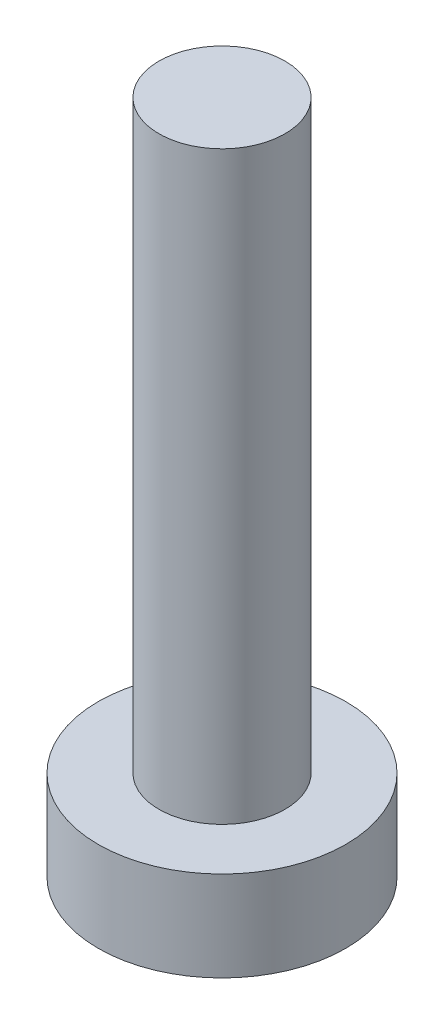
ISO-10303-21;
HEADER;
FILE_DESCRIPTION(('STEP AP214'),'2;1');
FILE_NAME('part.step','',(''),(''),'','','');
FILE_SCHEMA(('AUTOMOTIVE_DESIGN { 1 0 10303 214 1 1 1 1 }'));
ENDSEC;
DATA;
#1=APPLICATION_CONTEXT('core data for automotive mechanical design processes');
#2=APPLICATION_PROTOCOL_DEFINITION('international standard','automotive_design',2000,#1);
#3=PRODUCT_CONTEXT('',#1,'mechanical');
#4=PRODUCT('Part','Part','',(#3));
#5=PRODUCT_RELATED_PRODUCT_CATEGORY('part','',(#4));
#6=PRODUCT_DEFINITION_FORMATION('','',#4);
#7=PRODUCT_DEFINITION_CONTEXT('part definition',#1,'design');
#8=PRODUCT_DEFINITION('design','',#6,#7);
#9=PRODUCT_DEFINITION_SHAPE('','',#8);
#10=(LENGTH_UNIT() NAMED_UNIT(*) SI_UNIT(.MILLI.,.METRE.));
#11=(NAMED_UNIT(*) PLANE_ANGLE_UNIT() SI_UNIT($,.RADIAN.));
#12=(NAMED_UNIT(*) SI_UNIT($,.STERADIAN.) SOLID_ANGLE_UNIT());
#13=UNCERTAINTY_MEASURE_WITH_UNIT(LENGTH_MEASURE(1.E-05),#10,'distance_accuracy_value','');
#14=(GEOMETRIC_REPRESENTATION_CONTEXT(3) GLOBAL_UNCERTAINTY_ASSIGNED_CONTEXT((#13)) GLOBAL_UNIT_ASSIGNED_CONTEXT((#10,
#11,#12)) REPRESENTATION_CONTEXT('',''));
#15=CARTESIAN_POINT('',(0.,0.,0.));
#16=DIRECTION('',(0.,0.,1.));
#17=DIRECTION('',(1.,0.,0.));
#18=AXIS2_PLACEMENT_3D('',#15,#16,#17);
#19=CARTESIAN_POINT('',(0.,2.,0.));
#20=DIRECTION('',(0.,-1.,0.));
#21=DIRECTION('',(0.,0.,-1.));
#22=AXIS2_PLACEMENT_3D('',#19,#20,#21);
#23=CYLINDRICAL_SURFACE('',#22,2.75);
#24=CARTESIAN_POINT('',(0.,2.,0.));
#25=DIRECTION('',(0.,1.,0.));
#26=DIRECTION('',(0.,0.,1.));
#27=AXIS2_PLACEMENT_3D('',#24,#25,#26);
#28=CIRCLE('',#27,2.75);
#29=CARTESIAN_POINT('',(0.,2.,2.75));
#30=VERTEX_POINT('',#29);
#31=EDGE_CURVE('E48',#30,#30,#28,.T.);
#32=ORIENTED_EDGE('',*,*,#31,.F.);
#33=EDGE_LOOP('',(#32));
#34=FACE_BOUND('',#33,.T.);
#35=CARTESIAN_POINT('',(0.,0.,0.));
#36=DIRECTION('',(0.,1.,0.));
#37=DIRECTION('',(0.,0.,1.));
#38=AXIS2_PLACEMENT_3D('',#35,#36,#37);
#39=CIRCLE('',#38,2.75);
#40=CARTESIAN_POINT('',(0.,0.,2.75));
#41=VERTEX_POINT('',#40);
#42=EDGE_CURVE('E42',#41,#41,#39,.T.);
#43=ORIENTED_EDGE('',*,*,#42,.T.);
#44=EDGE_LOOP('',(#43));
#45=FACE_BOUND('',#44,.T.);
#46=ADVANCED_FACE('F39',(#34,#45),#23,.T.);
#47=CARTESIAN_POINT('',(0.,2.,0.));
#48=DIRECTION('',(0.,1.,0.));
#49=DIRECTION('',(0.,0.,1.));
#50=AXIS2_PLACEMENT_3D('',#47,#48,#49);
#51=PLANE('',#50);
#52=CARTESIAN_POINT('',(0.,2.,0.));
#53=DIRECTION('',(0.,1.,0.));
#54=DIRECTION('',(0.,0.,1.));
#55=AXIS2_PLACEMENT_3D('',#52,#53,#54);
#56=CIRCLE('',#55,1.4);
#57=CARTESIAN_POINT('',(0.,2.,-1.4));
#58=VERTEX_POINT('',#57);
#59=EDGE_CURVE('E11',#58,#58,#56,.T.);
#60=ORIENTED_EDGE('',*,*,#59,.F.);
#61=EDGE_LOOP('',(#60));
#62=FACE_BOUND('',#61,.T.);
#63=ORIENTED_EDGE('',*,*,#31,.T.);
#64=EDGE_LOOP('',(#63));
#65=FACE_BOUND('',#64,.T.);
#66=ADVANCED_FACE('F179',(#62,#65),#51,.T.);
#67=CARTESIAN_POINT('',(0.,0.,0.));
#68=DIRECTION('',(0.,1.,0.));
#69=DIRECTION('',(0.,0.,1.));
#70=AXIS2_PLACEMENT_3D('',#67,#68,#69);
#71=PLANE('',#70);
#72=DIRECTION('',(-0.5,0.,0.866025403784438));
#73=VECTOR('',#72,1.);
#74=CARTESIAN_POINT('',(1.15470053837925,0.,0.));
#75=LINE('',#74,#73);
#76=CARTESIAN_POINT('',(1.15470053837925,0.,0.));
#77=VERTEX_POINT('',#76);
#78=CARTESIAN_POINT('',(0.577350269189625,0.,1.));
#79=VERTEX_POINT('',#78);
#80=EDGE_CURVE('E136',#77,#79,#75,.T.);
#81=ORIENTED_EDGE('',*,*,#80,.F.);
#82=DIRECTION('',(0.5,0.,0.866025403784439));
#83=VECTOR('',#82,1.);
#84=CARTESIAN_POINT('',(0.577350269189626,0.,-1.));
#85=LINE('',#84,#83);
#86=CARTESIAN_POINT('',(0.577350269189626,0.,-1.));
#87=VERTEX_POINT('',#86);
#88=EDGE_CURVE('E56',#87,#77,#85,.T.);
#89=ORIENTED_EDGE('',*,*,#88,.F.);
#90=DIRECTION('',(1.,0.,0.));
#91=VECTOR('',#90,1.);
#92=CARTESIAN_POINT('',(-0.577350269189626,0.,-1.));
#93=LINE('',#92,#91);
#94=CARTESIAN_POINT('',(-0.577350269189626,0.,-1.));
#95=VERTEX_POINT('',#94);
#96=EDGE_CURVE('E149',#95,#87,#93,.T.);
#97=ORIENTED_EDGE('',*,*,#96,.F.);
#98=DIRECTION('',(0.5,0.,-0.866025403784438));
#99=VECTOR('',#98,1.);
#100=CARTESIAN_POINT('',(-1.15470053837925,0.,0.));
#101=LINE('',#100,#99);
#102=CARTESIAN_POINT('',(-1.15470053837925,0.,0.));
#103=VERTEX_POINT('',#102);
#104=EDGE_CURVE('E146',#103,#95,#101,.T.);
#105=ORIENTED_EDGE('',*,*,#104,.F.);
#106=DIRECTION('',(-0.5,0.,-0.866025403784439));
#107=VECTOR('',#106,1.);
#108=CARTESIAN_POINT('',(-0.577350269189626,0.,1.));
#109=LINE('',#108,#107);
#110=CARTESIAN_POINT('',(-0.577350269189626,0.,1.));
#111=VERTEX_POINT('',#110);
#112=EDGE_CURVE('E104',#111,#103,#109,.T.);
#113=ORIENTED_EDGE('',*,*,#112,.F.);
#114=DIRECTION('',(-1.,0.,0.));
#115=VECTOR('',#114,1.);
#116=CARTESIAN_POINT('',(0.577350269189625,0.,1.));
#117=LINE('',#116,#115);
#118=EDGE_CURVE('E140',#79,#111,#117,.T.);
#119=ORIENTED_EDGE('',*,*,#118,.F.);
#120=EDGE_LOOP('',(#81,#89,#97,#105,#113,#119));
#121=FACE_BOUND('',#120,.T.);
#122=ORIENTED_EDGE('',*,*,#42,.F.);
#123=EDGE_LOOP('',(#122));
#124=FACE_BOUND('',#123,.T.);
#125=ADVANCED_FACE('F176',(#121,#124),#71,.F.);
#126=CARTESIAN_POINT('',(0.,15.,0.));
#127=DIRECTION('',(0.,-1.,0.));
#128=DIRECTION('',(0.,0.,-1.));
#129=AXIS2_PLACEMENT_3D('',#126,#127,#128);
#130=CYLINDRICAL_SURFACE('',#129,1.4);
#131=CARTESIAN_POINT('',(0.,15.,0.));
#132=DIRECTION('',(0.,1.,0.));
#133=DIRECTION('',(0.,0.,1.));
#134=AXIS2_PLACEMENT_3D('',#131,#132,#133);
#135=CIRCLE('',#134,1.4);
#136=CARTESIAN_POINT('',(0.,15.,-1.4));
#137=VERTEX_POINT('',#136);
#138=EDGE_CURVE('E155',#137,#137,#135,.T.);
#139=CARTESIAN_POINT('',(0.,15.,-1.4));
#140=CARTESIAN_POINT('',(0.,14.8645833333333,-1.4));
#141=CARTESIAN_POINT('',(0.,14.7291666666667,-1.4));
#142=CARTESIAN_POINT('',(0.,14.4583333333333,-1.4));
#143=CARTESIAN_POINT('',(0.,14.3229166666667,-1.4));
#144=CARTESIAN_POINT('',(0.,14.0520833333333,-1.4));
#145=CARTESIAN_POINT('',(0.,13.9166666666667,-1.4));
#146=CARTESIAN_POINT('',(0.,13.6458333333333,-1.4));
#147=CARTESIAN_POINT('',(0.,13.5104166666667,-1.4));
#148=CARTESIAN_POINT('',(0.,13.2395833333333,-1.4));
#149=CARTESIAN_POINT('',(0.,13.1041666666667,-1.4));
#150=CARTESIAN_POINT('',(0.,12.8333333333333,-1.4));
#151=CARTESIAN_POINT('',(0.,12.6979166666667,-1.4));
#152=CARTESIAN_POINT('',(0.,12.4270833333333,-1.4));
#153=CARTESIAN_POINT('',(0.,12.2916666666667,-1.4));
#154=CARTESIAN_POINT('',(0.,12.0208333333333,-1.4));
#155=CARTESIAN_POINT('',(0.,11.8854166666667,-1.4));
#156=CARTESIAN_POINT('',(0.,11.6145833333333,-1.4));
#157=CARTESIAN_POINT('',(0.,11.4791666666667,-1.4));
#158=CARTESIAN_POINT('',(0.,11.2083333333333,-1.4));
#159=CARTESIAN_POINT('',(0.,11.0729166666667,-1.4));
#160=CARTESIAN_POINT('',(0.,10.8020833333333,-1.4));
#161=CARTESIAN_POINT('',(0.,10.6666666666667,-1.4));
#162=CARTESIAN_POINT('',(0.,10.3958333333333,-1.4));
#163=CARTESIAN_POINT('',(0.,10.2604166666667,-1.4));
#164=CARTESIAN_POINT('',(0.,9.98958333333333,-1.4));
#165=CARTESIAN_POINT('',(0.,9.85416666666667,-1.4));
#166=CARTESIAN_POINT('',(0.,9.58333333333333,-1.4));
#167=CARTESIAN_POINT('',(0.,9.44791666666667,-1.4));
#168=CARTESIAN_POINT('',(0.,9.17708333333333,-1.4));
#169=CARTESIAN_POINT('',(0.,9.04166666666667,-1.4));
#170=CARTESIAN_POINT('',(0.,8.77083333333333,-1.4));
#171=CARTESIAN_POINT('',(0.,8.63541666666667,-1.4));
#172=CARTESIAN_POINT('',(0.,8.36458333333333,-1.4));
#173=CARTESIAN_POINT('',(0.,8.22916666666667,-1.4));
#174=CARTESIAN_POINT('',(0.,7.95833333333333,-1.4));
#175=CARTESIAN_POINT('',(0.,7.82291666666667,-1.4));
#176=CARTESIAN_POINT('',(0.,7.55208333333333,-1.4));
#177=CARTESIAN_POINT('',(0.,7.41666666666667,-1.4));
#178=CARTESIAN_POINT('',(0.,7.14583333333333,-1.4));
#179=CARTESIAN_POINT('',(0.,7.01041666666667,-1.4));
#180=CARTESIAN_POINT('',(0.,6.73958333333333,-1.4));
#181=CARTESIAN_POINT('',(0.,6.60416666666667,-1.4));
#182=CARTESIAN_POINT('',(0.,6.33333333333333,-1.4));
#183=CARTESIAN_POINT('',(0.,6.19791666666667,-1.4));
#184=CARTESIAN_POINT('',(0.,5.92708333333333,-1.4));
#185=CARTESIAN_POINT('',(0.,5.79166666666667,-1.4));
#186=CARTESIAN_POINT('',(0.,5.52083333333333,-1.4));
#187=CARTESIAN_POINT('',(0.,5.38541666666667,-1.4));
#188=CARTESIAN_POINT('',(0.,5.11458333333333,-1.4));
#189=CARTESIAN_POINT('',(0.,4.97916666666667,-1.4));
#190=CARTESIAN_POINT('',(0.,4.70833333333333,-1.4));
#191=CARTESIAN_POINT('',(0.,4.57291666666667,-1.4));
#192=CARTESIAN_POINT('',(0.,4.30208333333333,-1.4));
#193=CARTESIAN_POINT('',(0.,4.16666666666667,-1.4));
#194=CARTESIAN_POINT('',(0.,3.89583333333333,-1.4));
#195=CARTESIAN_POINT('',(0.,3.76041666666667,-1.4));
#196=CARTESIAN_POINT('',(0.,3.48958333333333,-1.4));
#197=CARTESIAN_POINT('',(0.,3.35416666666667,-1.4));
#198=CARTESIAN_POINT('',(0.,3.08333333333333,-1.4));
#199=CARTESIAN_POINT('',(0.,2.94791666666667,-1.4));
#200=CARTESIAN_POINT('',(0.,2.67708333333333,-1.4));
#201=CARTESIAN_POINT('',(0.,2.54166666666667,-1.4));
#202=CARTESIAN_POINT('',(0.,2.27083333333333,-1.4));
#203=CARTESIAN_POINT('',(0.,2.13541666666667,-1.4));
#204=CARTESIAN_POINT('',(0.,2.,-1.4));
#205=B_SPLINE_CURVE_WITH_KNOTS('',3,(#139,#140,#141,#142,#143,#144,#145,#146,#147,#148,#149,
#150,#151,#152,#153,#154,#155,#156,#157,#158,#159,#160,#161,#162,#163,#164,#165,#166,#167,#168,
#169,#170,#171,#172,#173,#174,#175,#176,#177,#178,#179,#180,#181,#182,#183,#184,#185,#186,#187,
#188,#189,#190,#191,#192,#193,#194,#195,#196,#197,#198,#199,#200,#201,#202,#203,#204),
.UNSPECIFIED.,.F.,.F.,(4,2,2,2,2,2,2,2,2,2,2,2,2,2,2,2,2,2,2,2,2,2,2,2,2,2,2,2,2,2,2,2,4),(0.,
0.406249999999999,0.812499999999999,1.21875,1.625,2.03125,2.4375,2.84375,3.25,3.65625,4.0625,
4.46875,4.875,5.28125,5.6875,6.09375,6.5,6.90625,7.3125,7.71875,8.125,8.53125,8.9375,9.34375,
9.75,10.15625,10.5625,10.96875,11.375,11.78125,12.1875,12.59375,13.),.UNSPECIFIED.);
#206=EDGE_CURVE('BSEAM178',#137,#58,#205,.T.);
#207=ORIENTED_EDGE('',*,*,#138,.F.);
#208=ORIENTED_EDGE('',*,*,#59,.T.);
#209=ORIENTED_EDGE('',*,*,#206,.T.);
#210=ORIENTED_EDGE('',*,*,#206,.F.);
#211=EDGE_LOOP('',(#207,#209,#208,#210));
#212=FACE_BOUND('',#211,.T.);
#213=ADVANCED_FACE('F178',(#212),#130,.T.);
#214=CARTESIAN_POINT('',(0.,15.,0.));
#215=DIRECTION('',(0.,1.,0.));
#216=DIRECTION('',(0.,0.,1.));
#217=AXIS2_PLACEMENT_3D('',#214,#215,#216);
#218=PLANE('',#217);
#219=ORIENTED_EDGE('',*,*,#138,.T.);
#220=EDGE_LOOP('',(#219));
#221=FACE_BOUND('',#220,.T.);
#222=ADVANCED_FACE('F185',(#221),#218,.T.);
#223=CARTESIAN_POINT('',(0.577350269189626,1.5,-1.));
#224=DIRECTION('',(0.866025403784439,0.,-0.5));
#225=DIRECTION('',(-0.5,0.,-0.866025403784439));
#226=AXIS2_PLACEMENT_3D('',#223,#224,#225);
#227=PLANE('',#226);
#228=ORIENTED_EDGE('',*,*,#88,.T.);
#229=DIRECTION('',(0.,-1.,0.));
#230=VECTOR('',#229,1.);
#231=CARTESIAN_POINT('',(1.15470053837925,1.5,0.));
#232=LINE('',#231,#230);
#233=CARTESIAN_POINT('',(1.15470053837925,1.5,0.));
#234=VERTEX_POINT('',#233);
#235=EDGE_CURVE('E86',#234,#77,#232,.T.);
#236=ORIENTED_EDGE('',*,*,#235,.F.);
#237=DIRECTION('',(0.5,0.,0.866025403784439));
#238=VECTOR('',#237,1.);
#239=CARTESIAN_POINT('',(0.577350269189626,1.5,-1.));
#240=LINE('',#239,#238);
#241=CARTESIAN_POINT('',(0.577350269189626,1.5,-1.));
#242=VERTEX_POINT('',#241);
#243=EDGE_CURVE('E152',#242,#234,#240,.T.);
#244=ORIENTED_EDGE('',*,*,#243,.F.);
#245=DIRECTION('',(0.,-1.,0.));
#246=VECTOR('',#245,1.);
#247=CARTESIAN_POINT('',(0.577350269189626,1.5,-1.));
#248=LINE('',#247,#246);
#249=EDGE_CURVE('E64',#242,#87,#248,.T.);
#250=ORIENTED_EDGE('',*,*,#249,.T.);
#251=EDGE_LOOP('',(#228,#236,#244,#250));
#252=FACE_BOUND('',#251,.T.);
#253=ADVANCED_FACE('F214',(#252),#227,.F.);
#254=CARTESIAN_POINT('',(-0.577350269189626,1.5,-1.));
#255=DIRECTION('',(0.,0.,-1.));
#256=DIRECTION('',(-1.,0.,0.));
#257=AXIS2_PLACEMENT_3D('',#254,#255,#256);
#258=PLANE('',#257);
#259=ORIENTED_EDGE('',*,*,#96,.T.);
#260=ORIENTED_EDGE('',*,*,#249,.F.);
#261=DIRECTION('',(1.,0.,0.));
#262=VECTOR('',#261,1.);
#263=CARTESIAN_POINT('',(-0.577350269189626,1.5,-1.));
#264=LINE('',#263,#262);
#265=CARTESIAN_POINT('',(-0.577350269189626,1.5,-1.));
#266=VERTEX_POINT('',#265);
#267=EDGE_CURVE('E118',#266,#242,#264,.T.);
#268=ORIENTED_EDGE('',*,*,#267,.F.);
#269=DIRECTION('',(0.,-1.,0.));
#270=VECTOR('',#269,1.);
#271=CARTESIAN_POINT('',(-0.577350269189626,1.5,-1.));
#272=LINE('',#271,#270);
#273=EDGE_CURVE('E109',#266,#95,#272,.T.);
#274=ORIENTED_EDGE('',*,*,#273,.T.);
#275=EDGE_LOOP('',(#259,#260,#268,#274));
#276=FACE_BOUND('',#275,.T.);
#277=ADVANCED_FACE('F228',(#276),#258,.F.);
#278=CARTESIAN_POINT('',(-1.15470053837925,1.5,0.));
#279=DIRECTION('',(-0.866025403784439,0.,-0.5));
#280=DIRECTION('',(-0.5,0.,0.866025403784439));
#281=AXIS2_PLACEMENT_3D('',#278,#279,#280);
#282=PLANE('',#281);
#283=ORIENTED_EDGE('',*,*,#104,.T.);
#284=ORIENTED_EDGE('',*,*,#273,.F.);
#285=DIRECTION('',(0.5,0.,-0.866025403784438));
#286=VECTOR('',#285,1.);
#287=CARTESIAN_POINT('',(-1.15470053837925,1.5,0.));
#288=LINE('',#287,#286);
#289=CARTESIAN_POINT('',(-1.15470053837925,1.5,0.));
#290=VERTEX_POINT('',#289);
#291=EDGE_CURVE('E113',#290,#266,#288,.T.);
#292=ORIENTED_EDGE('',*,*,#291,.F.);
#293=DIRECTION('',(0.,-1.,0.));
#294=VECTOR('',#293,1.);
#295=CARTESIAN_POINT('',(-1.15470053837925,1.5,0.));
#296=LINE('',#295,#294);
#297=EDGE_CURVE('E97',#290,#103,#296,.T.);
#298=ORIENTED_EDGE('',*,*,#297,.T.);
#299=EDGE_LOOP('',(#283,#284,#292,#298));
#300=FACE_BOUND('',#299,.T.);
#301=ADVANCED_FACE('F114',(#300),#282,.F.);
#302=CARTESIAN_POINT('',(-0.577350269189626,1.5,1.));
#303=DIRECTION('',(-0.866025403784438,0.,0.5));
#304=DIRECTION('',(0.5,0.,0.866025403784439));
#305=AXIS2_PLACEMENT_3D('',#302,#303,#304);
#306=PLANE('',#305);
#307=ORIENTED_EDGE('',*,*,#112,.T.);
#308=ORIENTED_EDGE('',*,*,#297,.F.);
#309=DIRECTION('',(-0.5,0.,-0.866025403784439));
#310=VECTOR('',#309,1.);
#311=CARTESIAN_POINT('',(-0.577350269189626,1.5,1.));
#312=LINE('',#311,#310);
#313=CARTESIAN_POINT('',(-0.577350269189626,1.5,1.));
#314=VERTEX_POINT('',#313);
#315=EDGE_CURVE('E101',#314,#290,#312,.T.);
#316=ORIENTED_EDGE('',*,*,#315,.F.);
#317=DIRECTION('',(0.,-1.,0.));
#318=VECTOR('',#317,1.);
#319=CARTESIAN_POINT('',(-0.577350269189626,1.5,1.));
#320=LINE('',#319,#318);
#321=EDGE_CURVE('E110',#314,#111,#320,.T.);
#322=ORIENTED_EDGE('',*,*,#321,.T.);
#323=EDGE_LOOP('',(#307,#308,#316,#322));
#324=FACE_BOUND('',#323,.T.);
#325=ADVANCED_FACE('F99',(#324),#306,.F.);
#326=CARTESIAN_POINT('',(0.577350269189625,1.5,1.));
#327=DIRECTION('',(0.,0.,1.));
#328=DIRECTION('',(1.,0.,0.));
#329=AXIS2_PLACEMENT_3D('',#326,#327,#328);
#330=PLANE('',#329);
#331=ORIENTED_EDGE('',*,*,#118,.T.);
#332=ORIENTED_EDGE('',*,*,#321,.F.);
#333=DIRECTION('',(-1.,0.,0.));
#334=VECTOR('',#333,1.);
#335=CARTESIAN_POINT('',(0.577350269189625,1.5,1.));
#336=LINE('',#335,#334);
#337=CARTESIAN_POINT('',(0.577350269189625,1.5,1.));
#338=VERTEX_POINT('',#337);
#339=EDGE_CURVE('E124',#338,#314,#336,.T.);
#340=ORIENTED_EDGE('',*,*,#339,.F.);
#341=DIRECTION('',(0.,-1.,0.));
#342=VECTOR('',#341,1.);
#343=CARTESIAN_POINT('',(0.577350269189625,1.5,1.));
#344=LINE('',#343,#342);
#345=EDGE_CURVE('E160',#338,#79,#344,.T.);
#346=ORIENTED_EDGE('',*,*,#345,.T.);
#347=EDGE_LOOP('',(#331,#332,#340,#346));
#348=FACE_BOUND('',#347,.T.);
#349=ADVANCED_FACE('F253',(#348),#330,.F.);
#350=CARTESIAN_POINT('',(1.15470053837925,1.5,0.));
#351=DIRECTION('',(0.866025403784438,0.,0.5));
#352=DIRECTION('',(0.5,0.,-0.866025403784438));
#353=AXIS2_PLACEMENT_3D('',#350,#351,#352);
#354=PLANE('',#353);
#355=ORIENTED_EDGE('',*,*,#80,.T.);
#356=ORIENTED_EDGE('',*,*,#345,.F.);
#357=DIRECTION('',(-0.5,0.,0.866025403784438));
#358=VECTOR('',#357,1.);
#359=CARTESIAN_POINT('',(1.15470053837925,1.5,0.));
#360=LINE('',#359,#358);
#361=EDGE_CURVE('E128',#234,#338,#360,.T.);
#362=ORIENTED_EDGE('',*,*,#361,.F.);
#363=ORIENTED_EDGE('',*,*,#235,.T.);
#364=EDGE_LOOP('',(#355,#356,#362,#363));
#365=FACE_BOUND('',#364,.T.);
#366=ADVANCED_FACE('F262',(#365),#354,.F.);
#367=CARTESIAN_POINT('',(0.,1.5,0.));
#368=DIRECTION('',(0.,-1.,0.));
#369=DIRECTION('',(0.,0.,-1.));
#370=AXIS2_PLACEMENT_3D('',#367,#368,#369);
#371=PLANE('',#370);
#372=ORIENTED_EDGE('',*,*,#243,.T.);
#373=ORIENTED_EDGE('',*,*,#361,.T.);
#374=ORIENTED_EDGE('',*,*,#339,.T.);
#375=ORIENTED_EDGE('',*,*,#315,.T.);
#376=ORIENTED_EDGE('',*,*,#291,.T.);
#377=ORIENTED_EDGE('',*,*,#267,.T.);
#378=EDGE_LOOP('',(#372,#373,#374,#375,#376,#377));
#379=FACE_BOUND('',#378,.T.);
#380=ADVANCED_FACE('F121',(#379),#371,.T.);
#381=CLOSED_SHELL('',(#46,#66,#125,#213,#222,#253,#277,#301,#325,#349,#366,#380));
#382=MANIFOLD_SOLID_BREP('B2',#381);
#383=ADVANCED_BREP_SHAPE_REPRESENTATION('',(#18,#382),#14);
#384=SHAPE_DEFINITION_REPRESENTATION(#9,#383);
ENDSEC;
END-ISO-10303-21;
